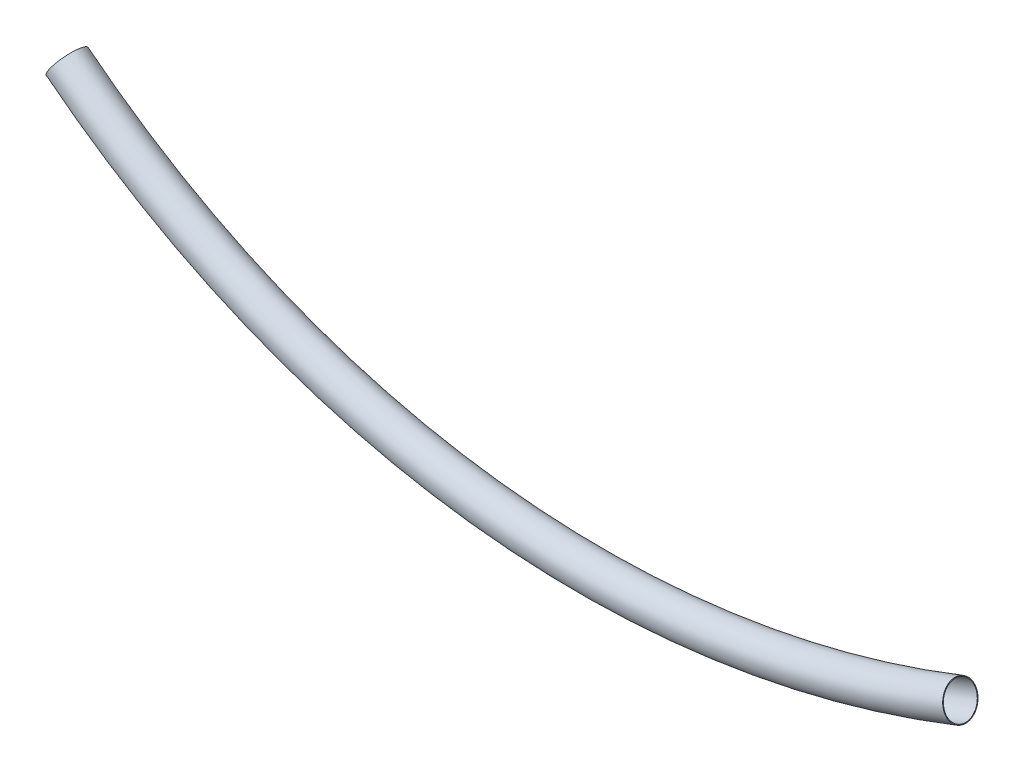
ISO-10303-21;
HEADER;
FILE_DESCRIPTION(('STEP AP214'),'2;1');
FILE_NAME('part.step','',(''),(''),'','','');
FILE_SCHEMA(('AUTOMOTIVE_DESIGN { 1 0 10303 214 1 1 1 1 }'));
ENDSEC;
DATA;
#1=APPLICATION_CONTEXT('core data for automotive mechanical design processes');
#2=APPLICATION_PROTOCOL_DEFINITION('international standard','automotive_design',2000,#1);
#3=PRODUCT_CONTEXT('',#1,'mechanical');
#4=PRODUCT('Part','Part','',(#3));
#5=PRODUCT_RELATED_PRODUCT_CATEGORY('part','',(#4));
#6=PRODUCT_DEFINITION_FORMATION('','',#4);
#7=PRODUCT_DEFINITION_CONTEXT('part definition',#1,'design');
#8=PRODUCT_DEFINITION('design','',#6,#7);
#9=PRODUCT_DEFINITION_SHAPE('','',#8);
#10=(LENGTH_UNIT() NAMED_UNIT(*) SI_UNIT(.MILLI.,.METRE.));
#11=(NAMED_UNIT(*) PLANE_ANGLE_UNIT() SI_UNIT($,.RADIAN.));
#12=(NAMED_UNIT(*) SI_UNIT($,.STERADIAN.) SOLID_ANGLE_UNIT());
#13=UNCERTAINTY_MEASURE_WITH_UNIT(LENGTH_MEASURE(1.E-05),#10,'distance_accuracy_value','');
#14=(GEOMETRIC_REPRESENTATION_CONTEXT(3) GLOBAL_UNCERTAINTY_ASSIGNED_CONTEXT((#13)) GLOBAL_UNIT_ASSIGNED_CONTEXT((#10,
#11,#12)) REPRESENTATION_CONTEXT('',''));
#15=CARTESIAN_POINT('',(0.,0.,0.));
#16=DIRECTION('',(0.,0.,1.));
#17=DIRECTION('',(1.,0.,0.));
#18=AXIS2_PLACEMENT_3D('',#15,#16,#17);
#19=CARTESIAN_POINT('',(3629.59201644663,474.860955787558,3160.07711591139));
#20=DIRECTION('',(0.0176715528555319,0.148748255784951,0.988717185357172));
#21=DIRECTION('',(0.,-0.98887160169456,0.148771487059972));
#22=AXIS2_PLACEMENT_3D('',#19,#20,#21);
#23=TOROIDAL_SURFACE('',#22,4771.54991284816,80.7338999999999);
#24=CARTESIAN_POINT('',(1016.63933489675,-3466.08789016431,3799.67781038665));
#25=DIRECTION('',(-0.836546491436689,0.543801072114006,-0.0668607630275294));
#26=DIRECTION('',(-0.545015793924001,-0.838425773035113,-8.65093298663827E-05));
#27=AXIS2_PLACEMENT_3D('',#24,#25,#26);
#28=CIRCLE('',#27,80.7338999999999);
#29=CARTESIAN_POINT('',(972.42857228292,-3532.7681462332,3810.49975701843));
#30=VERTEX_POINT('',#29);
#31=EDGE_CURVE('E40',#30,#30,#28,.T.);
#32=CARTESIAN_POINT('',(5240.59258807553,-3970.66979282709,3800.09437515865));
#33=DIRECTION('',(-0.941114351142537,-0.331446569951202,0.0666854507455971));
#34=DIRECTION('',(0.332186000076311,-0.943213900106069,0.));
#35=AXIS2_PLACEMENT_3D('',#32,#33,#34);
#36=CIRCLE('',#35,80.7338999999999);
#37=CARTESIAN_POINT('',(5267.85047312869,-4045.88749807191,3810.92337000312));
#38=VERTEX_POINT('',#37);
#39=EDGE_CURVE('E48',#38,#38,#36,.T.);
#40=CARTESIAN_POINT('',(3629.59201644663,474.860955787558,3160.07711591139));
#41=DIRECTION('',(0.0176715528555319,0.148748255784951,0.988717185357172));
#42=DIRECTION('',(0.,-0.98887160169456,0.148771487059972));
#43=AXIS2_PLACEMENT_3D('',#40,#41,#42);
#44=CIRCLE('',#43,4852.28381284816);
#45=EDGE_CURVE('',#30,#38,#44,.T.);
#46=ORIENTED_EDGE('',*,*,#31,.T.);
#47=ORIENTED_EDGE('',*,*,#39,.F.);
#48=ORIENTED_EDGE('',*,*,#45,.T.);
#49=ORIENTED_EDGE('',*,*,#45,.F.);
#50=EDGE_LOOP('',(#46,#48,#47,#49));
#51=FACE_BOUND('',#50,.T.);
#52=ADVANCED_FACE('F33',(#51),#23,.F.);
#53=CARTESIAN_POINT('',(3629.59201644663,474.860955787558,3160.07711591139));
#54=DIRECTION('',(0.0176715528555319,0.148748255784951,0.988717185357172));
#55=DIRECTION('',(0.,-0.98887160169456,0.148771487059972));
#56=AXIS2_PLACEMENT_3D('',#53,#54,#55);
#57=TOROIDAL_SURFACE('',#56,4771.54991284816,84.1375000000002);
#58=CARTESIAN_POINT('',(1016.63933489675,-3466.08789016431,3799.67781038665));
#59=DIRECTION('',(-0.836546491436689,0.543801072114006,-0.0668607630275294));
#60=DIRECTION('',(-0.545015793924001,-0.838425773035113,-8.65093298663827E-05));
#61=AXIS2_PLACEMENT_3D('',#58,#59,#60);
#62=CIRCLE('',#61,84.1375000000002);
#63=CARTESIAN_POINT('',(970.564723866921,-3535.57926918844,3810.9559913581));
#64=VERTEX_POINT('',#63);
#65=EDGE_CURVE('E11',#64,#64,#62,.T.);
#66=CARTESIAN_POINT('',(5240.59258807553,-3970.66979282709,3800.09437515865));
#67=DIRECTION('',(-0.941114351142537,-0.331446569951202,0.0666854507455971));
#68=DIRECTION('',(0.332186000076311,-0.943213900106069,0.));
#69=AXIS2_PLACEMENT_3D('',#66,#67,#68);
#70=CIRCLE('',#69,84.1375000000002);
#71=CARTESIAN_POINT('',(5268.9996178816,-4049.05854495025,3811.37990148311));
#72=VERTEX_POINT('',#71);
#73=EDGE_CURVE('E44',#72,#72,#70,.T.);
#74=CARTESIAN_POINT('',(3629.59201644663,474.860955787558,3160.07711591139));
#75=DIRECTION('',(0.0176715528555319,0.148748255784951,0.988717185357172));
#76=DIRECTION('',(0.,-0.98887160169456,0.148771487059972));
#77=AXIS2_PLACEMENT_3D('',#74,#75,#76);
#78=CIRCLE('',#77,4855.68741284816);
#79=EDGE_CURVE('',#64,#72,#78,.T.);
#80=ORIENTED_EDGE('',*,*,#65,.F.);
#81=ORIENTED_EDGE('',*,*,#73,.T.);
#82=ORIENTED_EDGE('',*,*,#79,.T.);
#83=ORIENTED_EDGE('',*,*,#79,.F.);
#84=EDGE_LOOP('',(#80,#82,#81,#83));
#85=FACE_BOUND('',#84,.T.);
#86=ADVANCED_FACE('F35',(#85),#57,.T.);
#87=CARTESIAN_POINT('',(1016.63933489675,-3466.08789016431,3799.67781038665));
#88=DIRECTION('',(-0.836546491436689,0.543801072114006,-0.0668607630275294));
#89=DIRECTION('',(-0.545015793924001,-0.838425773035113,-8.65093298663827E-05));
#90=AXIS2_PLACEMENT_3D('',#87,#88,#89);
#91=PLANE('',#90);
#92=ORIENTED_EDGE('',*,*,#31,.F.);
#93=EDGE_LOOP('',(#92));
#94=FACE_BOUND('',#93,.T.);
#95=ORIENTED_EDGE('',*,*,#65,.T.);
#96=EDGE_LOOP('',(#95));
#97=FACE_BOUND('',#96,.T.);
#98=ADVANCED_FACE('F58',(#94,#97),#91,.T.);
#99=CARTESIAN_POINT('',(5240.59258807553,-3970.66979282709,3800.09437515865));
#100=DIRECTION('',(-0.941114351142537,-0.331446569951202,0.0666854507455971));
#101=DIRECTION('',(0.332186000076311,-0.943213900106069,0.));
#102=AXIS2_PLACEMENT_3D('',#99,#100,#101);
#103=PLANE('',#102);
#104=ORIENTED_EDGE('',*,*,#39,.T.);
#105=EDGE_LOOP('',(#104));
#106=FACE_BOUND('',#105,.T.);
#107=ORIENTED_EDGE('',*,*,#73,.F.);
#108=EDGE_LOOP('',(#107));
#109=FACE_BOUND('',#108,.T.);
#110=ADVANCED_FACE('F54',(#106,#109),#103,.F.);
#111=CLOSED_SHELL('',(#52,#86,#98,#110));
#112=MANIFOLD_SOLID_BREP('B2',#111);
#113=ADVANCED_BREP_SHAPE_REPRESENTATION('',(#18,#112),#14);
#114=SHAPE_DEFINITION_REPRESENTATION(#9,#113);
ENDSEC;
END-ISO-10303-21;
